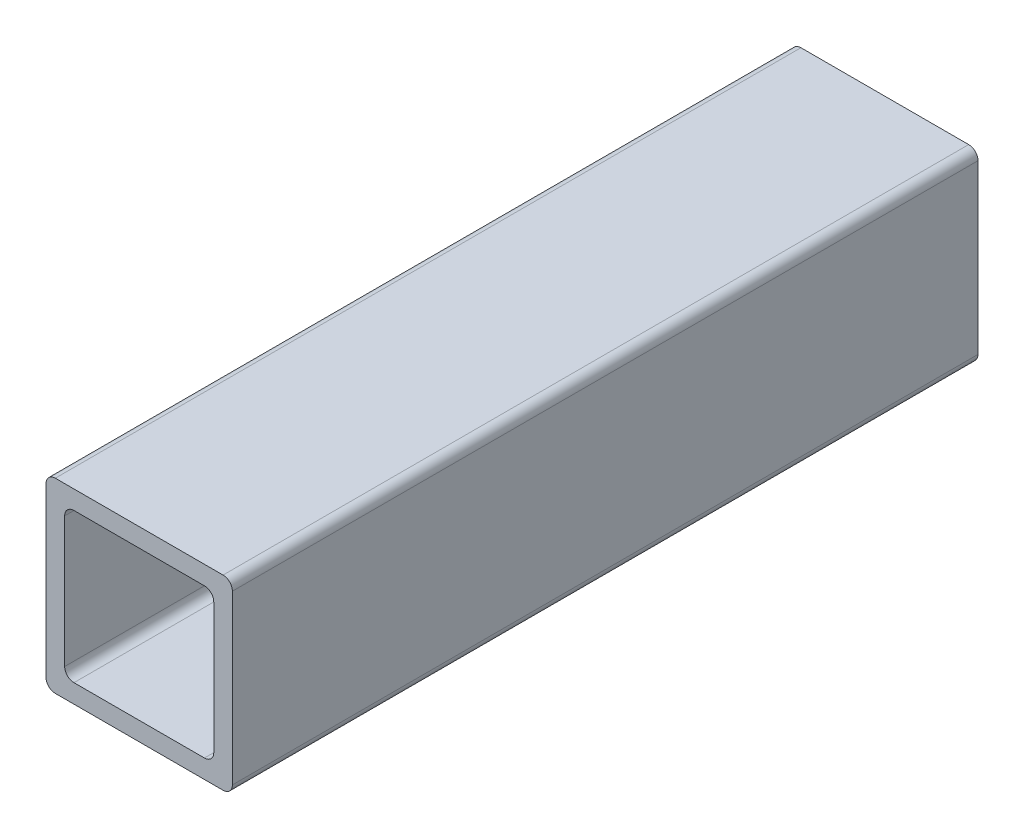
ISO-10303-21;
HEADER;
FILE_DESCRIPTION(('STEP AP214'),'2;1');
FILE_NAME('part.step','',(''),(''),'','','');
FILE_SCHEMA(('AUTOMOTIVE_DESIGN { 1 0 10303 214 1 1 1 1 }'));
ENDSEC;
DATA;
#1=APPLICATION_CONTEXT('core data for automotive mechanical design processes');
#2=APPLICATION_PROTOCOL_DEFINITION('international standard','automotive_design',2000,#1);
#3=PRODUCT_CONTEXT('',#1,'mechanical');
#4=PRODUCT('Part','Part','',(#3));
#5=PRODUCT_RELATED_PRODUCT_CATEGORY('part','',(#4));
#6=PRODUCT_DEFINITION_FORMATION('','',#4);
#7=PRODUCT_DEFINITION_CONTEXT('part definition',#1,'design');
#8=PRODUCT_DEFINITION('design','',#6,#7);
#9=PRODUCT_DEFINITION_SHAPE('','',#8);
#10=(LENGTH_UNIT() NAMED_UNIT(*) SI_UNIT(.MILLI.,.METRE.));
#11=(NAMED_UNIT(*) PLANE_ANGLE_UNIT() SI_UNIT($,.RADIAN.));
#12=(NAMED_UNIT(*) SI_UNIT($,.STERADIAN.) SOLID_ANGLE_UNIT());
#13=UNCERTAINTY_MEASURE_WITH_UNIT(LENGTH_MEASURE(1.E-05),#10,'distance_accuracy_value','');
#14=(GEOMETRIC_REPRESENTATION_CONTEXT(3) GLOBAL_UNCERTAINTY_ASSIGNED_CONTEXT((#13)) GLOBAL_UNIT_ASSIGNED_CONTEXT((#10,
#11,#12)) REPRESENTATION_CONTEXT('',''));
#15=CARTESIAN_POINT('',(0.,0.,0.));
#16=DIRECTION('',(0.,0.,1.));
#17=DIRECTION('',(1.,0.,0.));
#18=AXIS2_PLACEMENT_3D('',#15,#16,#17);
#19=CARTESIAN_POINT('',(0.,0.,101.6));
#20=DIRECTION('',(0.,0.,1.));
#21=DIRECTION('',(1.,0.,0.));
#22=AXIS2_PLACEMENT_3D('',#19,#20,#21);
#23=PLANE('',#22);
#24=DIRECTION('',(1.,0.,0.));
#25=VECTOR('',#24,1.);
#26=CARTESIAN_POINT('',(0.,0.,101.6));
#27=LINE('',#26,#25);
#28=CARTESIAN_POINT('',(-24.13,0.,101.6));
#29=VERTEX_POINT('',#28);
#30=CARTESIAN_POINT('',(-1.27,0.,101.6));
#31=VERTEX_POINT('',#30);
#32=EDGE_CURVE('E175',#29,#31,#27,.T.);
#33=ORIENTED_EDGE('',*,*,#32,.T.);
#34=CARTESIAN_POINT('',(-1.27,1.27,101.6));
#35=DIRECTION('',(0.,0.,1.));
#36=DIRECTION('',(1.,0.,0.));
#37=AXIS2_PLACEMENT_3D('',#34,#35,#36);
#38=CIRCLE('',#37,1.27);
#39=CARTESIAN_POINT('',(0.,1.27,101.6));
#40=VERTEX_POINT('',#39);
#41=EDGE_CURVE('E219',#31,#40,#38,.T.);
#42=ORIENTED_EDGE('',*,*,#41,.T.);
#43=DIRECTION('',(0.,1.,0.));
#44=VECTOR('',#43,1.);
#45=CARTESIAN_POINT('',(0.,0.,101.6));
#46=LINE('',#45,#44);
#47=CARTESIAN_POINT('',(0.,24.13,101.6));
#48=VERTEX_POINT('',#47);
#49=EDGE_CURVE('E269',#40,#48,#46,.T.);
#50=ORIENTED_EDGE('',*,*,#49,.T.);
#51=CARTESIAN_POINT('',(-1.27,24.13,101.6));
#52=DIRECTION('',(0.,0.,1.));
#53=DIRECTION('',(1.,0.,0.));
#54=AXIS2_PLACEMENT_3D('',#51,#52,#53);
#55=CIRCLE('',#54,1.27);
#56=CARTESIAN_POINT('',(-1.27,25.4,101.6));
#57=VERTEX_POINT('',#56);
#58=EDGE_CURVE('E215',#48,#57,#55,.T.);
#59=ORIENTED_EDGE('',*,*,#58,.T.);
#60=DIRECTION('',(-1.,0.,0.));
#61=VECTOR('',#60,1.);
#62=CARTESIAN_POINT('',(0.,25.4,101.6));
#63=LINE('',#62,#61);
#64=CARTESIAN_POINT('',(-24.13,25.4,101.6));
#65=VERTEX_POINT('',#64);
#66=EDGE_CURVE('E272',#57,#65,#63,.T.);
#67=ORIENTED_EDGE('',*,*,#66,.T.);
#68=CARTESIAN_POINT('',(-24.13,24.13,101.6));
#69=DIRECTION('',(0.,0.,1.));
#70=DIRECTION('',(1.,0.,0.));
#71=AXIS2_PLACEMENT_3D('',#68,#69,#70);
#72=CIRCLE('',#71,1.27);
#73=CARTESIAN_POINT('',(-25.4,24.13,101.6));
#74=VERTEX_POINT('',#73);
#75=EDGE_CURVE('E213',#65,#74,#72,.T.);
#76=ORIENTED_EDGE('',*,*,#75,.T.);
#77=DIRECTION('',(0.,-1.,0.));
#78=VECTOR('',#77,1.);
#79=CARTESIAN_POINT('',(-25.4,0.,101.6));
#80=LINE('',#79,#78);
#81=CARTESIAN_POINT('',(-25.4,1.27,101.6));
#82=VERTEX_POINT('',#81);
#83=EDGE_CURVE('E180',#74,#82,#80,.T.);
#84=ORIENTED_EDGE('',*,*,#83,.T.);
#85=CARTESIAN_POINT('',(-24.13,1.27,101.6));
#86=DIRECTION('',(0.,0.,1.));
#87=DIRECTION('',(1.,0.,0.));
#88=AXIS2_PLACEMENT_3D('',#85,#86,#87);
#89=CIRCLE('',#88,1.27);
#90=EDGE_CURVE('E217',#82,#29,#89,.T.);
#91=ORIENTED_EDGE('',*,*,#90,.T.);
#92=EDGE_LOOP('',(#33,#42,#50,#59,#67,#76,#84,#91));
#93=FACE_BOUND('',#92,.T.);
#94=DIRECTION('',(1.,0.,0.));
#95=VECTOR('',#94,1.);
#96=CARTESIAN_POINT('',(-2.54000000000001,2.53999999999999,101.6));
#97=LINE('',#96,#95);
#98=CARTESIAN_POINT('',(-21.59,2.53999999999998,101.6));
#99=VERTEX_POINT('',#98);
#100=CARTESIAN_POINT('',(-3.81,2.53999999999999,101.6));
#101=VERTEX_POINT('',#100);
#102=EDGE_CURVE('E254',#99,#101,#97,.T.);
#103=ORIENTED_EDGE('',*,*,#102,.F.);
#104=CARTESIAN_POINT('',(-21.59,3.80999999999998,101.6));
#105=DIRECTION('',(0.,0.,1.));
#106=DIRECTION('',(1.,0.,0.));
#107=AXIS2_PLACEMENT_3D('',#104,#105,#106);
#108=CIRCLE('',#107,1.27);
#109=CARTESIAN_POINT('',(-22.86,3.80999999999998,101.6));
#110=VERTEX_POINT('',#109);
#111=EDGE_CURVE('E11',#99,#110,#108,.F.);
#112=ORIENTED_EDGE('',*,*,#111,.T.);
#113=DIRECTION('',(0.,-1.,0.));
#114=VECTOR('',#113,1.);
#115=CARTESIAN_POINT('',(-22.86,2.53999999999998,101.6));
#116=LINE('',#115,#114);
#117=CARTESIAN_POINT('',(-22.86,21.59,101.6));
#118=VERTEX_POINT('',#117);
#119=EDGE_CURVE('E252',#118,#110,#116,.T.);
#120=ORIENTED_EDGE('',*,*,#119,.F.);
#121=CARTESIAN_POINT('',(-21.59,21.59,101.6));
#122=DIRECTION('',(0.,0.,1.));
#123=DIRECTION('',(1.,0.,0.));
#124=AXIS2_PLACEMENT_3D('',#121,#122,#123);
#125=CIRCLE('',#124,1.27);
#126=CARTESIAN_POINT('',(-21.59,22.86,101.6));
#127=VERTEX_POINT('',#126);
#128=EDGE_CURVE('E163',#118,#127,#125,.F.);
#129=ORIENTED_EDGE('',*,*,#128,.T.);
#130=DIRECTION('',(-1.,0.,0.));
#131=VECTOR('',#130,1.);
#132=CARTESIAN_POINT('',(-2.54,22.86,101.6));
#133=LINE('',#132,#131);
#134=CARTESIAN_POINT('',(-3.81,22.86,101.6));
#135=VERTEX_POINT('',#134);
#136=EDGE_CURVE('E264',#135,#127,#133,.T.);
#137=ORIENTED_EDGE('',*,*,#136,.F.);
#138=CARTESIAN_POINT('',(-3.81,21.59,101.6));
#139=DIRECTION('',(0.,0.,1.));
#140=DIRECTION('',(1.,0.,0.));
#141=AXIS2_PLACEMENT_3D('',#138,#139,#140);
#142=CIRCLE('',#141,1.27);
#143=CARTESIAN_POINT('',(-2.54,21.59,101.6));
#144=VERTEX_POINT('',#143);
#145=EDGE_CURVE('E236',#135,#144,#142,.F.);
#146=ORIENTED_EDGE('',*,*,#145,.T.);
#147=DIRECTION('',(0.,1.,0.));
#148=VECTOR('',#147,1.);
#149=CARTESIAN_POINT('',(-2.54000000000001,2.53999999999999,101.6));
#150=LINE('',#149,#148);
#151=CARTESIAN_POINT('',(-2.54,3.80999999999999,101.6));
#152=VERTEX_POINT('',#151);
#153=EDGE_CURVE('E259',#152,#144,#150,.T.);
#154=ORIENTED_EDGE('',*,*,#153,.F.);
#155=CARTESIAN_POINT('',(-3.81000000000001,3.80999999999999,101.6));
#156=DIRECTION('',(0.,0.,1.));
#157=DIRECTION('',(1.,0.,0.));
#158=AXIS2_PLACEMENT_3D('',#155,#156,#157);
#159=CIRCLE('',#158,1.27);
#160=EDGE_CURVE('E54',#152,#101,#159,.F.);
#161=ORIENTED_EDGE('',*,*,#160,.T.);
#162=EDGE_LOOP('',(#103,#112,#120,#129,#137,#146,#154,#161));
#163=FACE_BOUND('',#162,.T.);
#164=ADVANCED_FACE('F39',(#93,#163),#23,.T.);
#165=CARTESIAN_POINT('',(0.,0.,0.));
#166=DIRECTION('',(0.,0.,1.));
#167=DIRECTION('',(1.,0.,0.));
#168=AXIS2_PLACEMENT_3D('',#165,#166,#167);
#169=PLANE('',#168);
#170=DIRECTION('',(0.,1.,0.));
#171=VECTOR('',#170,1.);
#172=CARTESIAN_POINT('',(0.,0.,0.));
#173=LINE('',#172,#171);
#174=CARTESIAN_POINT('',(0.,1.27,0.));
#175=VERTEX_POINT('',#174);
#176=CARTESIAN_POINT('',(0.,24.13,0.));
#177=VERTEX_POINT('',#176);
#178=EDGE_CURVE('E267',#175,#177,#173,.T.);
#179=ORIENTED_EDGE('',*,*,#178,.F.);
#180=CARTESIAN_POINT('',(-1.27,1.27,0.));
#181=DIRECTION('',(0.,0.,1.));
#182=DIRECTION('',(1.,0.,0.));
#183=AXIS2_PLACEMENT_3D('',#180,#181,#182);
#184=CIRCLE('',#183,1.27);
#185=CARTESIAN_POINT('',(-1.27,0.,0.));
#186=VERTEX_POINT('',#185);
#187=EDGE_CURVE('E206',#175,#186,#184,.F.);
#188=ORIENTED_EDGE('',*,*,#187,.T.);
#189=DIRECTION('',(1.,0.,0.));
#190=VECTOR('',#189,1.);
#191=CARTESIAN_POINT('',(0.,0.,0.));
#192=LINE('',#191,#190);
#193=CARTESIAN_POINT('',(-24.13,0.,0.));
#194=VERTEX_POINT('',#193);
#195=EDGE_CURVE('E183',#194,#186,#192,.T.);
#196=ORIENTED_EDGE('',*,*,#195,.F.);
#197=CARTESIAN_POINT('',(-24.13,1.27,0.));
#198=DIRECTION('',(0.,0.,1.));
#199=DIRECTION('',(1.,0.,0.));
#200=AXIS2_PLACEMENT_3D('',#197,#198,#199);
#201=CIRCLE('',#200,1.27);
#202=CARTESIAN_POINT('',(-25.4,1.27,0.));
#203=VERTEX_POINT('',#202);
#204=EDGE_CURVE('E204',#194,#203,#201,.F.);
#205=ORIENTED_EDGE('',*,*,#204,.T.);
#206=DIRECTION('',(0.,-1.,0.));
#207=VECTOR('',#206,1.);
#208=CARTESIAN_POINT('',(-25.4,0.,0.));
#209=LINE('',#208,#207);
#210=CARTESIAN_POINT('',(-25.4,24.13,0.));
#211=VERTEX_POINT('',#210);
#212=EDGE_CURVE('E281',#211,#203,#209,.T.);
#213=ORIENTED_EDGE('',*,*,#212,.F.);
#214=CARTESIAN_POINT('',(-24.13,24.13,0.));
#215=DIRECTION('',(0.,0.,1.));
#216=DIRECTION('',(1.,0.,0.));
#217=AXIS2_PLACEMENT_3D('',#214,#215,#216);
#218=CIRCLE('',#217,1.27);
#219=CARTESIAN_POINT('',(-24.13,25.4,0.));
#220=VERTEX_POINT('',#219);
#221=EDGE_CURVE('E200',#211,#220,#218,.F.);
#222=ORIENTED_EDGE('',*,*,#221,.T.);
#223=DIRECTION('',(-1.,0.,0.));
#224=VECTOR('',#223,1.);
#225=CARTESIAN_POINT('',(0.,25.4,0.));
#226=LINE('',#225,#224);
#227=CARTESIAN_POINT('',(-1.27,25.4,0.));
#228=VERTEX_POINT('',#227);
#229=EDGE_CURVE('E279',#228,#220,#226,.T.);
#230=ORIENTED_EDGE('',*,*,#229,.F.);
#231=CARTESIAN_POINT('',(-1.27,24.13,0.));
#232=DIRECTION('',(0.,0.,1.));
#233=DIRECTION('',(1.,0.,0.));
#234=AXIS2_PLACEMENT_3D('',#231,#232,#233);
#235=CIRCLE('',#234,1.27);
#236=EDGE_CURVE('E202',#228,#177,#235,.F.);
#237=ORIENTED_EDGE('',*,*,#236,.T.);
#238=EDGE_LOOP('',(#179,#188,#196,#205,#213,#222,#230,#237));
#239=FACE_BOUND('',#238,.T.);
#240=DIRECTION('',(-1.,0.,0.));
#241=VECTOR('',#240,1.);
#242=CARTESIAN_POINT('',(-2.54,22.86,0.));
#243=LINE('',#242,#241);
#244=CARTESIAN_POINT('',(-3.81,22.86,0.));
#245=VERTEX_POINT('',#244);
#246=CARTESIAN_POINT('',(-21.59,22.86,0.));
#247=VERTEX_POINT('',#246);
#248=EDGE_CURVE('E172',#245,#247,#243,.T.);
#249=ORIENTED_EDGE('',*,*,#248,.T.);
#250=CARTESIAN_POINT('',(-21.59,21.59,0.));
#251=DIRECTION('',(0.,0.,1.));
#252=DIRECTION('',(1.,0.,0.));
#253=AXIS2_PLACEMENT_3D('',#250,#251,#252);
#254=CIRCLE('',#253,1.27);
#255=CARTESIAN_POINT('',(-22.86,21.59,0.));
#256=VERTEX_POINT('',#255);
#257=EDGE_CURVE('E238',#247,#256,#254,.T.);
#258=ORIENTED_EDGE('',*,*,#257,.T.);
#259=DIRECTION('',(0.,-1.,0.));
#260=VECTOR('',#259,1.);
#261=CARTESIAN_POINT('',(-22.86,2.53999999999998,0.));
#262=LINE('',#261,#260);
#263=CARTESIAN_POINT('',(-22.86,3.80999999999998,0.));
#264=VERTEX_POINT('',#263);
#265=EDGE_CURVE('E243',#256,#264,#262,.T.);
#266=ORIENTED_EDGE('',*,*,#265,.T.);
#267=CARTESIAN_POINT('',(-21.59,3.80999999999998,0.));
#268=DIRECTION('',(0.,0.,1.));
#269=DIRECTION('',(1.,0.,0.));
#270=AXIS2_PLACEMENT_3D('',#267,#268,#269);
#271=CIRCLE('',#270,1.27);
#272=CARTESIAN_POINT('',(-21.59,2.53999999999998,0.));
#273=VERTEX_POINT('',#272);
#274=EDGE_CURVE('E47',#264,#273,#271,.T.);
#275=ORIENTED_EDGE('',*,*,#274,.T.);
#276=DIRECTION('',(1.,0.,0.));
#277=VECTOR('',#276,1.);
#278=CARTESIAN_POINT('',(-2.54000000000001,2.53999999999999,0.));
#279=LINE('',#278,#277);
#280=CARTESIAN_POINT('',(-3.81,2.53999999999999,0.));
#281=VERTEX_POINT('',#280);
#282=EDGE_CURVE('E158',#273,#281,#279,.T.);
#283=ORIENTED_EDGE('',*,*,#282,.T.);
#284=CARTESIAN_POINT('',(-3.81000000000001,3.80999999999999,0.));
#285=DIRECTION('',(0.,0.,1.));
#286=DIRECTION('',(1.,0.,0.));
#287=AXIS2_PLACEMENT_3D('',#284,#285,#286);
#288=CIRCLE('',#287,1.27);
#289=CARTESIAN_POINT('',(-2.54,3.80999999999999,0.));
#290=VERTEX_POINT('',#289);
#291=EDGE_CURVE('E153',#281,#290,#288,.T.);
#292=ORIENTED_EDGE('',*,*,#291,.T.);
#293=DIRECTION('',(0.,1.,0.));
#294=VECTOR('',#293,1.);
#295=CARTESIAN_POINT('',(-2.54000000000001,2.53999999999999,0.));
#296=LINE('',#295,#294);
#297=CARTESIAN_POINT('',(-2.54,21.59,0.));
#298=VERTEX_POINT('',#297);
#299=EDGE_CURVE('E157',#290,#298,#296,.T.);
#300=ORIENTED_EDGE('',*,*,#299,.T.);
#301=CARTESIAN_POINT('',(-3.81,21.59,0.));
#302=DIRECTION('',(0.,0.,1.));
#303=DIRECTION('',(1.,0.,0.));
#304=AXIS2_PLACEMENT_3D('',#301,#302,#303);
#305=CIRCLE('',#304,1.27);
#306=EDGE_CURVE('E234',#298,#245,#305,.T.);
#307=ORIENTED_EDGE('',*,*,#306,.T.);
#308=EDGE_LOOP('',(#249,#258,#266,#275,#283,#292,#300,#307));
#309=FACE_BOUND('',#308,.T.);
#310=ADVANCED_FACE('F156',(#239,#309),#169,.F.);
#311=CARTESIAN_POINT('',(0.,0.,101.6));
#312=DIRECTION('',(-1.,0.,0.));
#313=DIRECTION('',(0.,-1.,0.));
#314=AXIS2_PLACEMENT_3D('',#311,#312,#313);
#315=PLANE('',#314);
#316=ORIENTED_EDGE('',*,*,#49,.F.);
#317=DIRECTION('',(0.,0.,-1.));
#318=VECTOR('',#317,1.);
#319=CARTESIAN_POINT('',(0.,1.27,101.6));
#320=LINE('',#319,#318);
#321=EDGE_CURVE('E197',#40,#175,#320,.T.);
#322=ORIENTED_EDGE('',*,*,#321,.T.);
#323=ORIENTED_EDGE('',*,*,#178,.T.);
#324=DIRECTION('',(0.,0.,-1.));
#325=VECTOR('',#324,1.);
#326=CARTESIAN_POINT('',(0.,24.13,101.6));
#327=LINE('',#326,#325);
#328=EDGE_CURVE('E195',#177,#48,#327,.F.);
#329=ORIENTED_EDGE('',*,*,#328,.T.);
#330=EDGE_LOOP('',(#316,#322,#323,#329));
#331=FACE_BOUND('',#330,.T.);
#332=ADVANCED_FACE('F302',(#331),#315,.F.);
#333=CARTESIAN_POINT('',(0.,25.4,101.6));
#334=DIRECTION('',(0.,-1.,0.));
#335=DIRECTION('',(0.,0.,-1.));
#336=AXIS2_PLACEMENT_3D('',#333,#334,#335);
#337=PLANE('',#336);
#338=ORIENTED_EDGE('',*,*,#66,.F.);
#339=DIRECTION('',(0.,0.,-1.));
#340=VECTOR('',#339,1.);
#341=CARTESIAN_POINT('',(-1.27,25.4,101.6));
#342=LINE('',#341,#340);
#343=EDGE_CURVE('E231',#57,#228,#342,.T.);
#344=ORIENTED_EDGE('',*,*,#343,.T.);
#345=ORIENTED_EDGE('',*,*,#229,.T.);
#346=DIRECTION('',(0.,0.,-1.));
#347=VECTOR('',#346,1.);
#348=CARTESIAN_POINT('',(-24.13,25.4,101.6));
#349=LINE('',#348,#347);
#350=EDGE_CURVE('E229',#220,#65,#349,.F.);
#351=ORIENTED_EDGE('',*,*,#350,.T.);
#352=EDGE_LOOP('',(#338,#344,#345,#351));
#353=FACE_BOUND('',#352,.T.);
#354=ADVANCED_FACE('F311',(#353),#337,.F.);
#355=CARTESIAN_POINT('',(-25.4,0.,101.6));
#356=DIRECTION('',(1.,0.,0.));
#357=DIRECTION('',(0.,1.,0.));
#358=AXIS2_PLACEMENT_3D('',#355,#356,#357);
#359=PLANE('',#358);
#360=ORIENTED_EDGE('',*,*,#212,.T.);
#361=DIRECTION('',(0.,0.,-1.));
#362=VECTOR('',#361,1.);
#363=CARTESIAN_POINT('',(-25.4,1.27,101.6));
#364=LINE('',#363,#362);
#365=EDGE_CURVE('E227',#203,#82,#364,.F.);
#366=ORIENTED_EDGE('',*,*,#365,.T.);
#367=ORIENTED_EDGE('',*,*,#83,.F.);
#368=DIRECTION('',(0.,0.,-1.));
#369=VECTOR('',#368,1.);
#370=CARTESIAN_POINT('',(-25.4,24.13,101.6));
#371=LINE('',#370,#369);
#372=EDGE_CURVE('E224',#74,#211,#371,.T.);
#373=ORIENTED_EDGE('',*,*,#372,.T.);
#374=EDGE_LOOP('',(#360,#366,#367,#373));
#375=FACE_BOUND('',#374,.T.);
#376=ADVANCED_FACE('F318',(#375),#359,.F.);
#377=CARTESIAN_POINT('',(0.,0.,101.6));
#378=DIRECTION('',(0.,1.,0.));
#379=DIRECTION('',(0.,0.,1.));
#380=AXIS2_PLACEMENT_3D('',#377,#378,#379);
#381=PLANE('',#380);
#382=ORIENTED_EDGE('',*,*,#195,.T.);
#383=DIRECTION('',(0.,0.,-1.));
#384=VECTOR('',#383,1.);
#385=CARTESIAN_POINT('',(-1.27,0.,101.6));
#386=LINE('',#385,#384);
#387=EDGE_CURVE('E211',#186,#31,#386,.F.);
#388=ORIENTED_EDGE('',*,*,#387,.T.);
#389=ORIENTED_EDGE('',*,*,#32,.F.);
#390=DIRECTION('',(0.,0.,-1.));
#391=VECTOR('',#390,1.);
#392=CARTESIAN_POINT('',(-24.13,0.,101.6));
#393=LINE('',#392,#391);
#394=EDGE_CURVE('E208',#29,#194,#393,.T.);
#395=ORIENTED_EDGE('',*,*,#394,.T.);
#396=EDGE_LOOP('',(#382,#388,#389,#395));
#397=FACE_BOUND('',#396,.T.);
#398=ADVANCED_FACE('F290',(#397),#381,.F.);
#399=CARTESIAN_POINT('',(-22.86,2.53999999999998,101.6));
#400=DIRECTION('',(1.,0.,0.));
#401=DIRECTION('',(0.,1.,0.));
#402=AXIS2_PLACEMENT_3D('',#399,#400,#401);
#403=PLANE('',#402);
#404=ORIENTED_EDGE('',*,*,#265,.F.);
#405=DIRECTION('',(0.,0.,-1.));
#406=VECTOR('',#405,1.);
#407=CARTESIAN_POINT('',(-22.86,21.59,101.6));
#408=LINE('',#407,#406);
#409=EDGE_CURVE('E193',#256,#118,#408,.F.);
#410=ORIENTED_EDGE('',*,*,#409,.T.);
#411=ORIENTED_EDGE('',*,*,#119,.T.);
#412=DIRECTION('',(0.,0.,-1.));
#413=VECTOR('',#412,1.);
#414=CARTESIAN_POINT('',(-22.86,3.80999999999998,0.));
#415=LINE('',#414,#413);
#416=EDGE_CURVE('E190',#110,#264,#415,.T.);
#417=ORIENTED_EDGE('',*,*,#416,.T.);
#418=EDGE_LOOP('',(#404,#410,#411,#417));
#419=FACE_BOUND('',#418,.T.);
#420=ADVANCED_FACE('F256',(#419),#403,.T.);
#421=CARTESIAN_POINT('',(-2.54000000000001,2.53999999999999,101.6));
#422=DIRECTION('',(0.,1.,0.));
#423=DIRECTION('',(-1.,0.,0.));
#424=AXIS2_PLACEMENT_3D('',#421,#422,#423);
#425=PLANE('',#424);
#426=ORIENTED_EDGE('',*,*,#102,.T.);
#427=DIRECTION('',(0.,0.,-1.));
#428=VECTOR('',#427,1.);
#429=CARTESIAN_POINT('',(-3.81,2.53999999999999,0.));
#430=LINE('',#429,#428);
#431=EDGE_CURVE('E222',#101,#281,#430,.T.);
#432=ORIENTED_EDGE('',*,*,#431,.T.);
#433=ORIENTED_EDGE('',*,*,#282,.F.);
#434=DIRECTION('',(0.,0.,-1.));
#435=VECTOR('',#434,1.);
#436=CARTESIAN_POINT('',(-21.59,2.53999999999998,101.6));
#437=LINE('',#436,#435);
#438=EDGE_CURVE('E61',#273,#99,#437,.F.);
#439=ORIENTED_EDGE('',*,*,#438,.T.);
#440=EDGE_LOOP('',(#426,#432,#433,#439));
#441=FACE_BOUND('',#440,.T.);
#442=ADVANCED_FACE('F246',(#441),#425,.T.);
#443=CARTESIAN_POINT('',(-2.54000000000001,2.53999999999999,101.6));
#444=DIRECTION('',(-1.,0.,0.));
#445=DIRECTION('',(0.,-1.,0.));
#446=AXIS2_PLACEMENT_3D('',#443,#444,#445);
#447=PLANE('',#446);
#448=ORIENTED_EDGE('',*,*,#153,.T.);
#449=DIRECTION('',(0.,0.,-1.));
#450=VECTOR('',#449,1.);
#451=CARTESIAN_POINT('',(-2.54,21.59,0.));
#452=LINE('',#451,#450);
#453=EDGE_CURVE('E171',#144,#298,#452,.T.);
#454=ORIENTED_EDGE('',*,*,#453,.T.);
#455=ORIENTED_EDGE('',*,*,#299,.F.);
#456=DIRECTION('',(0.,0.,-1.));
#457=VECTOR('',#456,1.);
#458=CARTESIAN_POINT('',(-2.54,3.80999999999999,101.6));
#459=LINE('',#458,#457);
#460=EDGE_CURVE('E169',#290,#152,#459,.F.);
#461=ORIENTED_EDGE('',*,*,#460,.T.);
#462=EDGE_LOOP('',(#448,#454,#455,#461));
#463=FACE_BOUND('',#462,.T.);
#464=ADVANCED_FACE('F168',(#463),#447,.T.);
#465=CARTESIAN_POINT('',(-2.54,22.86,101.6));
#466=DIRECTION('',(0.,-1.,0.));
#467=DIRECTION('',(1.,0.,0.));
#468=AXIS2_PLACEMENT_3D('',#465,#466,#467);
#469=PLANE('',#468);
#470=ORIENTED_EDGE('',*,*,#248,.F.);
#471=DIRECTION('',(0.,0.,-1.));
#472=VECTOR('',#471,1.);
#473=CARTESIAN_POINT('',(-3.81,22.86,101.6));
#474=LINE('',#473,#472);
#475=EDGE_CURVE('E188',#245,#135,#474,.F.);
#476=ORIENTED_EDGE('',*,*,#475,.T.);
#477=ORIENTED_EDGE('',*,*,#136,.T.);
#478=DIRECTION('',(0.,0.,-1.));
#479=VECTOR('',#478,1.);
#480=CARTESIAN_POINT('',(-21.59,22.86,0.));
#481=LINE('',#480,#479);
#482=EDGE_CURVE('E177',#127,#247,#481,.T.);
#483=ORIENTED_EDGE('',*,*,#482,.T.);
#484=EDGE_LOOP('',(#470,#476,#477,#483));
#485=FACE_BOUND('',#484,.T.);
#486=ADVANCED_FACE('F341',(#485),#469,.T.);
#487=CARTESIAN_POINT('',(-3.81,21.59,101.6));
#488=DIRECTION('',(0.,0.,1.));
#489=DIRECTION('',(1.,0.,0.));
#490=AXIS2_PLACEMENT_3D('',#487,#488,#489);
#491=CYLINDRICAL_SURFACE('',#490,1.27);
#492=ORIENTED_EDGE('',*,*,#145,.F.);
#493=ORIENTED_EDGE('',*,*,#475,.F.);
#494=ORIENTED_EDGE('',*,*,#306,.F.);
#495=ORIENTED_EDGE('',*,*,#453,.F.);
#496=EDGE_LOOP('',(#492,#493,#494,#495));
#497=FACE_BOUND('',#496,.T.);
#498=ADVANCED_FACE('F337',(#497),#491,.F.);
#499=CARTESIAN_POINT('',(-21.59,21.59,101.6));
#500=DIRECTION('',(0.,0.,1.));
#501=DIRECTION('',(1.,0.,0.));
#502=AXIS2_PLACEMENT_3D('',#499,#500,#501);
#503=CYLINDRICAL_SURFACE('',#502,1.27);
#504=ORIENTED_EDGE('',*,*,#128,.F.);
#505=ORIENTED_EDGE('',*,*,#409,.F.);
#506=ORIENTED_EDGE('',*,*,#257,.F.);
#507=ORIENTED_EDGE('',*,*,#482,.F.);
#508=EDGE_LOOP('',(#504,#505,#506,#507));
#509=FACE_BOUND('',#508,.T.);
#510=ADVANCED_FACE('F340',(#509),#503,.F.);
#511=CARTESIAN_POINT('',(-1.27,1.27,101.6));
#512=DIRECTION('',(0.,0.,-1.));
#513=DIRECTION('',(-1.,0.,0.));
#514=AXIS2_PLACEMENT_3D('',#511,#512,#513);
#515=CYLINDRICAL_SURFACE('',#514,1.27);
#516=ORIENTED_EDGE('',*,*,#41,.F.);
#517=ORIENTED_EDGE('',*,*,#387,.F.);
#518=ORIENTED_EDGE('',*,*,#187,.F.);
#519=ORIENTED_EDGE('',*,*,#321,.F.);
#520=EDGE_LOOP('',(#516,#517,#518,#519));
#521=FACE_BOUND('',#520,.T.);
#522=ADVANCED_FACE('F296',(#521),#515,.T.);
#523=CARTESIAN_POINT('',(-3.81000000000001,3.80999999999999,101.6));
#524=DIRECTION('',(0.,0.,1.));
#525=DIRECTION('',(1.,0.,0.));
#526=AXIS2_PLACEMENT_3D('',#523,#524,#525);
#527=CYLINDRICAL_SURFACE('',#526,1.27);
#528=ORIENTED_EDGE('',*,*,#160,.F.);
#529=ORIENTED_EDGE('',*,*,#460,.F.);
#530=ORIENTED_EDGE('',*,*,#291,.F.);
#531=ORIENTED_EDGE('',*,*,#431,.F.);
#532=EDGE_LOOP('',(#528,#529,#530,#531));
#533=FACE_BOUND('',#532,.T.);
#534=ADVANCED_FACE('F174',(#533),#527,.F.);
#535=CARTESIAN_POINT('',(-21.59,3.80999999999998,101.6));
#536=DIRECTION('',(0.,0.,1.));
#537=DIRECTION('',(1.,0.,0.));
#538=AXIS2_PLACEMENT_3D('',#535,#536,#537);
#539=CYLINDRICAL_SURFACE('',#538,1.27);
#540=ORIENTED_EDGE('',*,*,#111,.F.);
#541=ORIENTED_EDGE('',*,*,#438,.F.);
#542=ORIENTED_EDGE('',*,*,#274,.F.);
#543=ORIENTED_EDGE('',*,*,#416,.F.);
#544=EDGE_LOOP('',(#540,#541,#542,#543));
#545=FACE_BOUND('',#544,.T.);
#546=ADVANCED_FACE('F249',(#545),#539,.F.);
#547=CARTESIAN_POINT('',(-24.13,1.27,101.6));
#548=DIRECTION('',(0.,0.,-1.));
#549=DIRECTION('',(-1.,0.,0.));
#550=AXIS2_PLACEMENT_3D('',#547,#548,#549);
#551=CYLINDRICAL_SURFACE('',#550,1.27);
#552=ORIENTED_EDGE('',*,*,#90,.F.);
#553=ORIENTED_EDGE('',*,*,#365,.F.);
#554=ORIENTED_EDGE('',*,*,#204,.F.);
#555=ORIENTED_EDGE('',*,*,#394,.F.);
#556=EDGE_LOOP('',(#552,#553,#554,#555));
#557=FACE_BOUND('',#556,.T.);
#558=ADVANCED_FACE('F320',(#557),#551,.T.);
#559=CARTESIAN_POINT('',(-1.27,24.13,101.6));
#560=DIRECTION('',(0.,0.,-1.));
#561=DIRECTION('',(-1.,0.,0.));
#562=AXIS2_PLACEMENT_3D('',#559,#560,#561);
#563=CYLINDRICAL_SURFACE('',#562,1.27);
#564=ORIENTED_EDGE('',*,*,#58,.F.);
#565=ORIENTED_EDGE('',*,*,#328,.F.);
#566=ORIENTED_EDGE('',*,*,#236,.F.);
#567=ORIENTED_EDGE('',*,*,#343,.F.);
#568=EDGE_LOOP('',(#564,#565,#566,#567));
#569=FACE_BOUND('',#568,.T.);
#570=ADVANCED_FACE('F306',(#569),#563,.T.);
#571=CARTESIAN_POINT('',(-24.13,24.13,101.6));
#572=DIRECTION('',(0.,0.,-1.));
#573=DIRECTION('',(-1.,0.,0.));
#574=AXIS2_PLACEMENT_3D('',#571,#572,#573);
#575=CYLINDRICAL_SURFACE('',#574,1.27);
#576=ORIENTED_EDGE('',*,*,#75,.F.);
#577=ORIENTED_EDGE('',*,*,#350,.F.);
#578=ORIENTED_EDGE('',*,*,#221,.F.);
#579=ORIENTED_EDGE('',*,*,#372,.F.);
#580=EDGE_LOOP('',(#576,#577,#578,#579));
#581=FACE_BOUND('',#580,.T.);
#582=ADVANCED_FACE('F41',(#581),#575,.T.);
#583=CLOSED_SHELL('',(#164,#310,#332,#354,#376,#398,#420,#442,#464,#486,#498,#510,#522,#534,
#546,#558,#570,#582));
#584=MANIFOLD_SOLID_BREP('B2',#583);
#585=ADVANCED_BREP_SHAPE_REPRESENTATION('',(#18,#584),#14);
#586=SHAPE_DEFINITION_REPRESENTATION(#9,#585);
ENDSEC;
END-ISO-10303-21;
